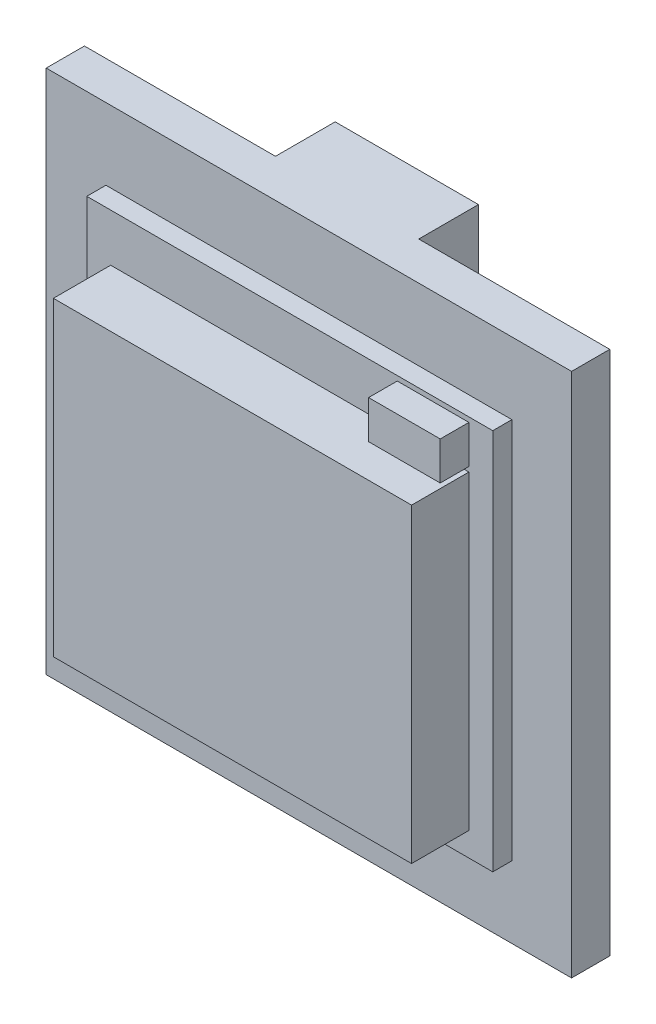
ISO-10303-21;
HEADER;
FILE_DESCRIPTION(('STEP AP214'),'2;1');
FILE_NAME('part.step','',(''),(''),'','','');
FILE_SCHEMA(('AUTOMOTIVE_DESIGN { 1 0 10303 214 1 1 1 1 }'));
ENDSEC;
DATA;
#1=APPLICATION_CONTEXT('core data for automotive mechanical design processes');
#2=APPLICATION_PROTOCOL_DEFINITION('international standard','automotive_design',2000,#1);
#3=PRODUCT_CONTEXT('',#1,'mechanical');
#4=PRODUCT('Part','Part','',(#3));
#5=PRODUCT_RELATED_PRODUCT_CATEGORY('part','',(#4));
#6=PRODUCT_DEFINITION_FORMATION('','',#4);
#7=PRODUCT_DEFINITION_CONTEXT('part definition',#1,'design');
#8=PRODUCT_DEFINITION('design','',#6,#7);
#9=PRODUCT_DEFINITION_SHAPE('','',#8);
#10=(LENGTH_UNIT() NAMED_UNIT(*) SI_UNIT(.MILLI.,.METRE.));
#11=(NAMED_UNIT(*) PLANE_ANGLE_UNIT() SI_UNIT($,.RADIAN.));
#12=(NAMED_UNIT(*) SI_UNIT($,.STERADIAN.) SOLID_ANGLE_UNIT());
#13=UNCERTAINTY_MEASURE_WITH_UNIT(LENGTH_MEASURE(1.E-05),#10,'distance_accuracy_value','');
#14=(GEOMETRIC_REPRESENTATION_CONTEXT(3) GLOBAL_UNCERTAINTY_ASSIGNED_CONTEXT((#13)) GLOBAL_UNIT_ASSIGNED_CONTEXT((#10,
#11,#12)) REPRESENTATION_CONTEXT('',''));
#15=CARTESIAN_POINT('',(0.,0.,0.));
#16=DIRECTION('',(0.,0.,1.));
#17=DIRECTION('',(1.,0.,0.));
#18=AXIS2_PLACEMENT_3D('',#15,#16,#17);
#19=CARTESIAN_POINT('',(0.,0.,15.5));
#20=DIRECTION('',(0.,0.,-1.));
#21=DIRECTION('',(-1.,0.,0.));
#22=AXIS2_PLACEMENT_3D('',#19,#20,#21);
#23=PLANE('',#22);
#24=DIRECTION('',(0.,1.,0.));
#25=VECTOR('',#24,1.);
#26=CARTESIAN_POINT('',(25.5,57.,15.5));
#27=LINE('',#26,#25);
#28=CARTESIAN_POINT('',(25.5,57.,15.5));
#29=VERTEX_POINT('',#28);
#30=CARTESIAN_POINT('',(25.5,70.,15.5));
#31=VERTEX_POINT('',#30);
#32=EDGE_CURVE('E197',#29,#31,#27,.T.);
#33=ORIENTED_EDGE('',*,*,#32,.F.);
#34=DIRECTION('',(1.,0.,0.));
#35=VECTOR('',#34,1.);
#36=CARTESIAN_POINT('',(10.5,57.,15.5));
#37=LINE('',#36,#35);
#38=CARTESIAN_POINT('',(10.5,57.,15.5));
#39=VERTEX_POINT('',#38);
#40=EDGE_CURVE('E210',#39,#29,#37,.T.);
#41=ORIENTED_EDGE('',*,*,#40,.F.);
#42=DIRECTION('',(0.,-1.,0.));
#43=VECTOR('',#42,1.);
#44=CARTESIAN_POINT('',(10.5,57.,15.5));
#45=LINE('',#44,#43);
#46=CARTESIAN_POINT('',(10.5,70.,15.5));
#47=VERTEX_POINT('',#46);
#48=EDGE_CURVE('E219',#47,#39,#45,.T.);
#49=ORIENTED_EDGE('',*,*,#48,.F.);
#50=DIRECTION('',(-1.,0.,0.));
#51=VECTOR('',#50,1.);
#52=CARTESIAN_POINT('',(10.5,70.,15.5));
#53=LINE('',#52,#51);
#54=EDGE_CURVE('E200',#31,#47,#53,.T.);
#55=ORIENTED_EDGE('',*,*,#54,.F.);
#56=EDGE_LOOP('',(#33,#41,#49,#55));
#57=FACE_BOUND('',#56,.T.);
#58=DIRECTION('',(0.,1.,0.));
#59=VECTOR('',#58,1.);
#60=CARTESIAN_POINT('',(26.5,56.,15.5));
#61=LINE('',#60,#59);
#62=CARTESIAN_POINT('',(26.5,56.,15.5));
#63=VERTEX_POINT('',#62);
#64=CARTESIAN_POINT('',(26.5,72.,15.5));
#65=VERTEX_POINT('',#64);
#66=EDGE_CURVE('E236',#63,#65,#61,.T.);
#67=ORIENTED_EDGE('',*,*,#66,.T.);
#68=DIRECTION('',(-1.,0.,0.));
#69=VECTOR('',#68,1.);
#70=CARTESIAN_POINT('',(9.5,72.,15.5));
#71=LINE('',#70,#69);
#72=CARTESIAN_POINT('',(9.5,72.,15.5));
#73=VERTEX_POINT('',#72);
#74=EDGE_CURVE('E239',#65,#73,#71,.T.);
#75=ORIENTED_EDGE('',*,*,#74,.T.);
#76=DIRECTION('',(0.,-1.,0.));
#77=VECTOR('',#76,1.);
#78=CARTESIAN_POINT('',(9.5,56.,15.5));
#79=LINE('',#78,#77);
#80=CARTESIAN_POINT('',(9.5,56.,15.5));
#81=VERTEX_POINT('',#80);
#82=EDGE_CURVE('E242',#73,#81,#79,.T.);
#83=ORIENTED_EDGE('',*,*,#82,.T.);
#84=DIRECTION('',(1.,0.,0.));
#85=VECTOR('',#84,1.);
#86=CARTESIAN_POINT('',(9.5,56.,15.5));
#87=LINE('',#86,#85);
#88=EDGE_CURVE('E244',#81,#63,#87,.T.);
#89=ORIENTED_EDGE('',*,*,#88,.T.);
#90=EDGE_LOOP('',(#67,#75,#83,#89));
#91=FACE_BOUND('',#90,.T.);
#92=DIRECTION('',(0.,1.,0.));
#93=VECTOR('',#92,1.);
#94=CARTESIAN_POINT('',(25.5,70.2,15.5));
#95=LINE('',#94,#93);
#96=CARTESIAN_POINT('',(25.5,70.2,15.5));
#97=VERTEX_POINT('',#96);
#98=CARTESIAN_POINT('',(25.5,71.8,15.5));
#99=VERTEX_POINT('',#98);
#100=EDGE_CURVE('E196',#97,#99,#95,.T.);
#101=ORIENTED_EDGE('',*,*,#100,.F.);
#102=DIRECTION('',(1.,0.,0.));
#103=VECTOR('',#102,1.);
#104=CARTESIAN_POINT('',(22.5,70.2,15.5));
#105=LINE('',#104,#103);
#106=CARTESIAN_POINT('',(22.5,70.2,15.5));
#107=VERTEX_POINT('',#106);
#108=EDGE_CURVE('E193',#107,#97,#105,.T.);
#109=ORIENTED_EDGE('',*,*,#108,.F.);
#110=DIRECTION('',(0.,-1.,0.));
#111=VECTOR('',#110,1.);
#112=CARTESIAN_POINT('',(22.5,70.2,15.5));
#113=LINE('',#112,#111);
#114=CARTESIAN_POINT('',(22.5,71.8,15.5));
#115=VERTEX_POINT('',#114);
#116=EDGE_CURVE('E59',#115,#107,#113,.T.);
#117=ORIENTED_EDGE('',*,*,#116,.F.);
#118=DIRECTION('',(-1.,0.,0.));
#119=VECTOR('',#118,1.);
#120=CARTESIAN_POINT('',(22.5,71.8,15.5));
#121=LINE('',#120,#119);
#122=EDGE_CURVE('E54',#99,#115,#121,.T.);
#123=ORIENTED_EDGE('',*,*,#122,.F.);
#124=EDGE_LOOP('',(#101,#109,#117,#123));
#125=FACE_BOUND('',#124,.T.);
#126=ADVANCED_FACE('F39',(#57,#91,#125),#23,.F.);
#127=CARTESIAN_POINT('',(0.,0.,14.7));
#128=DIRECTION('',(0.,0.,-1.));
#129=DIRECTION('',(-1.,0.,0.));
#130=AXIS2_PLACEMENT_3D('',#127,#128,#129);
#131=PLANE('',#130);
#132=DIRECTION('',(0.,1.,0.));
#133=VECTOR('',#132,1.);
#134=CARTESIAN_POINT('',(29.,53.,14.7));
#135=LINE('',#134,#133);
#136=CARTESIAN_POINT('',(29.,53.,14.7));
#137=VERTEX_POINT('',#136);
#138=CARTESIAN_POINT('',(29.,75.,14.7));
#139=VERTEX_POINT('',#138);
#140=EDGE_CURVE('E269',#137,#139,#135,.T.);
#141=ORIENTED_EDGE('',*,*,#140,.T.);
#142=DIRECTION('',(-1.,0.,0.));
#143=VECTOR('',#142,1.);
#144=CARTESIAN_POINT('',(7.,75.,14.7));
#145=LINE('',#144,#143);
#146=CARTESIAN_POINT('',(7.,75.,14.7));
#147=VERTEX_POINT('',#146);
#148=EDGE_CURVE('E272',#139,#147,#145,.T.);
#149=ORIENTED_EDGE('',*,*,#148,.T.);
#150=DIRECTION('',(0.,-1.,0.));
#151=VECTOR('',#150,1.);
#152=CARTESIAN_POINT('',(7.,53.,14.7));
#153=LINE('',#152,#151);
#154=CARTESIAN_POINT('',(7.,53.,14.7));
#155=VERTEX_POINT('',#154);
#156=EDGE_CURVE('E275',#147,#155,#153,.T.);
#157=ORIENTED_EDGE('',*,*,#156,.T.);
#158=DIRECTION('',(1.,0.,0.));
#159=VECTOR('',#158,1.);
#160=CARTESIAN_POINT('',(7.,53.,14.7));
#161=LINE('',#160,#159);
#162=EDGE_CURVE('E277',#155,#137,#161,.T.);
#163=ORIENTED_EDGE('',*,*,#162,.T.);
#164=EDGE_LOOP('',(#141,#149,#157,#163));
#165=FACE_BOUND('',#164,.T.);
#166=DIRECTION('',(0.,1.,0.));
#167=VECTOR('',#166,1.);
#168=CARTESIAN_POINT('',(26.5,56.,14.7));
#169=LINE('',#168,#167);
#170=CARTESIAN_POINT('',(26.5,56.,14.7));
#171=VERTEX_POINT('',#170);
#172=CARTESIAN_POINT('',(26.5,72.,14.7));
#173=VERTEX_POINT('',#172);
#174=EDGE_CURVE('E235',#171,#173,#169,.T.);
#175=ORIENTED_EDGE('',*,*,#174,.F.);
#176=DIRECTION('',(1.,0.,0.));
#177=VECTOR('',#176,1.);
#178=CARTESIAN_POINT('',(9.5,56.,14.7));
#179=LINE('',#178,#177);
#180=CARTESIAN_POINT('',(9.5,56.,14.7));
#181=VERTEX_POINT('',#180);
#182=EDGE_CURVE('E240',#181,#171,#179,.T.);
#183=ORIENTED_EDGE('',*,*,#182,.F.);
#184=DIRECTION('',(0.,-1.,0.));
#185=VECTOR('',#184,1.);
#186=CARTESIAN_POINT('',(9.5,56.,14.7));
#187=LINE('',#186,#185);
#188=CARTESIAN_POINT('',(9.5,72.,14.7));
#189=VERTEX_POINT('',#188);
#190=EDGE_CURVE('E252',#189,#181,#187,.T.);
#191=ORIENTED_EDGE('',*,*,#190,.F.);
#192=DIRECTION('',(-1.,0.,0.));
#193=VECTOR('',#192,1.);
#194=CARTESIAN_POINT('',(9.5,72.,14.7));
#195=LINE('',#194,#193);
#196=EDGE_CURVE('E249',#173,#189,#195,.T.);
#197=ORIENTED_EDGE('',*,*,#196,.F.);
#198=EDGE_LOOP('',(#175,#183,#191,#197));
#199=FACE_BOUND('',#198,.T.);
#200=ADVANCED_FACE('F348',(#165,#199),#131,.F.);
#201=CARTESIAN_POINT('',(21.,53.,13.1));
#202=DIRECTION('',(-1.,0.,0.));
#203=DIRECTION('',(0.,0.,1.));
#204=AXIS2_PLACEMENT_3D('',#201,#202,#203);
#205=PLANE('',#204);
#206=DIRECTION('',(0.,1.,0.));
#207=VECTOR('',#206,1.);
#208=CARTESIAN_POINT('',(21.,53.,10.6));
#209=LINE('',#208,#207);
#210=CARTESIAN_POINT('',(21.,53.,10.6));
#211=VERTEX_POINT('',#210);
#212=CARTESIAN_POINT('',(21.,75.,10.6));
#213=VERTEX_POINT('',#212);
#214=EDGE_CURVE('E302',#211,#213,#209,.T.);
#215=ORIENTED_EDGE('',*,*,#214,.T.);
#216=DIRECTION('',(0.,0.,-1.));
#217=VECTOR('',#216,1.);
#218=CARTESIAN_POINT('',(21.,75.,13.1));
#219=LINE('',#218,#217);
#220=CARTESIAN_POINT('',(21.,75.,13.1));
#221=VERTEX_POINT('',#220);
#222=EDGE_CURVE('E11',#221,#213,#219,.T.);
#223=ORIENTED_EDGE('',*,*,#222,.F.);
#224=DIRECTION('',(0.,1.,0.));
#225=VECTOR('',#224,1.);
#226=CARTESIAN_POINT('',(21.,53.,13.1));
#227=LINE('',#226,#225);
#228=CARTESIAN_POINT('',(21.,53.,13.1));
#229=VERTEX_POINT('',#228);
#230=EDGE_CURVE('E303',#229,#221,#227,.T.);
#231=ORIENTED_EDGE('',*,*,#230,.F.);
#232=DIRECTION('',(0.,0.,-1.));
#233=VECTOR('',#232,1.);
#234=CARTESIAN_POINT('',(21.,53.,13.1));
#235=LINE('',#234,#233);
#236=EDGE_CURVE('E310',#229,#211,#235,.T.);
#237=ORIENTED_EDGE('',*,*,#236,.T.);
#238=EDGE_LOOP('',(#215,#223,#231,#237));
#239=FACE_BOUND('',#238,.T.);
#240=ADVANCED_FACE('F41',(#239),#205,.F.);
#241=CARTESIAN_POINT('',(15.,75.,13.1));
#242=DIRECTION('',(0.,-1.,0.));
#243=DIRECTION('',(0.,0.,-1.));
#244=AXIS2_PLACEMENT_3D('',#241,#242,#243);
#245=PLANE('',#244);
#246=DIRECTION('',(-1.,0.,0.));
#247=VECTOR('',#246,1.);
#248=CARTESIAN_POINT('',(15.,75.,10.6));
#249=LINE('',#248,#247);
#250=CARTESIAN_POINT('',(15.,75.,10.6));
#251=VERTEX_POINT('',#250);
#252=EDGE_CURVE('E313',#213,#251,#249,.T.);
#253=ORIENTED_EDGE('',*,*,#252,.T.);
#254=DIRECTION('',(0.,0.,-1.));
#255=VECTOR('',#254,1.);
#256=CARTESIAN_POINT('',(15.,75.,13.1));
#257=LINE('',#256,#255);
#258=CARTESIAN_POINT('',(15.,75.,13.1));
#259=VERTEX_POINT('',#258);
#260=EDGE_CURVE('E47',#259,#251,#257,.T.);
#261=ORIENTED_EDGE('',*,*,#260,.F.);
#262=DIRECTION('',(-1.,0.,0.));
#263=VECTOR('',#262,1.);
#264=CARTESIAN_POINT('',(7.,75.,13.1));
#265=LINE('',#264,#263);
#266=CARTESIAN_POINT('',(7.,75.,13.1));
#267=VERTEX_POINT('',#266);
#268=EDGE_CURVE('E282',#259,#267,#265,.T.);
#269=ORIENTED_EDGE('',*,*,#268,.T.);
#270=DIRECTION('',(0.,0.,-1.));
#271=VECTOR('',#270,1.);
#272=CARTESIAN_POINT('',(7.,75.,14.7));
#273=LINE('',#272,#271);
#274=EDGE_CURVE('E296',#147,#267,#273,.T.);
#275=ORIENTED_EDGE('',*,*,#274,.F.);
#276=ORIENTED_EDGE('',*,*,#148,.F.);
#277=DIRECTION('',(0.,0.,-1.));
#278=VECTOR('',#277,1.);
#279=CARTESIAN_POINT('',(29.,75.,14.7));
#280=LINE('',#279,#278);
#281=CARTESIAN_POINT('',(29.,75.,13.1));
#282=VERTEX_POINT('',#281);
#283=EDGE_CURVE('E299',#139,#282,#280,.T.);
#284=ORIENTED_EDGE('',*,*,#283,.T.);
#285=EDGE_CURVE('E283',#282,#221,#265,.T.);
#286=ORIENTED_EDGE('',*,*,#285,.T.);
#287=ORIENTED_EDGE('',*,*,#222,.T.);
#288=EDGE_LOOP('',(#253,#261,#269,#275,#276,#284,#286,#287));
#289=FACE_BOUND('',#288,.T.);
#290=ADVANCED_FACE('F358',(#289),#245,.F.);
#291=CARTESIAN_POINT('',(15.,53.,13.1));
#292=DIRECTION('',(1.,0.,0.));
#293=DIRECTION('',(0.,0.,-1.));
#294=AXIS2_PLACEMENT_3D('',#291,#292,#293);
#295=PLANE('',#294);
#296=DIRECTION('',(0.,-1.,0.));
#297=VECTOR('',#296,1.);
#298=CARTESIAN_POINT('',(15.,53.,10.6));
#299=LINE('',#298,#297);
#300=CARTESIAN_POINT('',(15.,53.,10.6));
#301=VERTEX_POINT('',#300);
#302=EDGE_CURVE('E315',#251,#301,#299,.T.);
#303=ORIENTED_EDGE('',*,*,#302,.T.);
#304=DIRECTION('',(0.,0.,-1.));
#305=VECTOR('',#304,1.);
#306=CARTESIAN_POINT('',(15.,53.,13.1));
#307=LINE('',#306,#305);
#308=CARTESIAN_POINT('',(15.,53.,13.1));
#309=VERTEX_POINT('',#308);
#310=EDGE_CURVE('E320',#309,#301,#307,.T.);
#311=ORIENTED_EDGE('',*,*,#310,.F.);
#312=DIRECTION('',(0.,-1.,0.));
#313=VECTOR('',#312,1.);
#314=CARTESIAN_POINT('',(15.,53.,13.1));
#315=LINE('',#314,#313);
#316=EDGE_CURVE('E306',#259,#309,#315,.T.);
#317=ORIENTED_EDGE('',*,*,#316,.F.);
#318=ORIENTED_EDGE('',*,*,#260,.T.);
#319=EDGE_LOOP('',(#303,#311,#317,#318));
#320=FACE_BOUND('',#319,.T.);
#321=ADVANCED_FACE('F326',(#320),#295,.F.);
#322=CARTESIAN_POINT('',(15.,53.,13.1));
#323=DIRECTION('',(0.,1.,0.));
#324=DIRECTION('',(0.,0.,1.));
#325=AXIS2_PLACEMENT_3D('',#322,#323,#324);
#326=PLANE('',#325);
#327=DIRECTION('',(1.,0.,0.));
#328=VECTOR('',#327,1.);
#329=CARTESIAN_POINT('',(15.,53.,10.6));
#330=LINE('',#329,#328);
#331=EDGE_CURVE('E307',#301,#211,#330,.T.);
#332=ORIENTED_EDGE('',*,*,#331,.T.);
#333=ORIENTED_EDGE('',*,*,#236,.F.);
#334=DIRECTION('',(1.,0.,0.));
#335=VECTOR('',#334,1.);
#336=CARTESIAN_POINT('',(7.,53.,13.1));
#337=LINE('',#336,#335);
#338=CARTESIAN_POINT('',(29.,53.,13.1));
#339=VERTEX_POINT('',#338);
#340=EDGE_CURVE('E288',#229,#339,#337,.T.);
#341=ORIENTED_EDGE('',*,*,#340,.T.);
#342=DIRECTION('',(0.,0.,-1.));
#343=VECTOR('',#342,1.);
#344=CARTESIAN_POINT('',(29.,53.,14.7));
#345=LINE('',#344,#343);
#346=EDGE_CURVE('E279',#137,#339,#345,.T.);
#347=ORIENTED_EDGE('',*,*,#346,.F.);
#348=ORIENTED_EDGE('',*,*,#162,.F.);
#349=DIRECTION('',(0.,0.,-1.));
#350=VECTOR('',#349,1.);
#351=CARTESIAN_POINT('',(7.,53.,14.7));
#352=LINE('',#351,#350);
#353=CARTESIAN_POINT('',(7.,53.,13.1));
#354=VERTEX_POINT('',#353);
#355=EDGE_CURVE('E293',#155,#354,#352,.T.);
#356=ORIENTED_EDGE('',*,*,#355,.T.);
#357=EDGE_CURVE('E273',#354,#309,#337,.T.);
#358=ORIENTED_EDGE('',*,*,#357,.T.);
#359=ORIENTED_EDGE('',*,*,#310,.T.);
#360=EDGE_LOOP('',(#332,#333,#341,#347,#348,#356,#358,#359));
#361=FACE_BOUND('',#360,.T.);
#362=ADVANCED_FACE('F334',(#361),#326,.F.);
#363=CARTESIAN_POINT('',(0.,0.,10.6));
#364=DIRECTION('',(0.,0.,-1.));
#365=DIRECTION('',(-1.,0.,0.));
#366=AXIS2_PLACEMENT_3D('',#363,#364,#365);
#367=PLANE('',#366);
#368=ORIENTED_EDGE('',*,*,#214,.F.);
#369=ORIENTED_EDGE('',*,*,#331,.F.);
#370=ORIENTED_EDGE('',*,*,#302,.F.);
#371=ORIENTED_EDGE('',*,*,#252,.F.);
#372=EDGE_LOOP('',(#368,#369,#370,#371));
#373=FACE_BOUND('',#372,.T.);
#374=ADVANCED_FACE('F332',(#373),#367,.T.);
#375=CARTESIAN_POINT('',(0.,0.,13.1));
#376=DIRECTION('',(0.,0.,-1.));
#377=DIRECTION('',(-1.,0.,0.));
#378=AXIS2_PLACEMENT_3D('',#375,#376,#377);
#379=PLANE('',#378);
#380=ORIENTED_EDGE('',*,*,#340,.F.);
#381=ORIENTED_EDGE('',*,*,#230,.T.);
#382=ORIENTED_EDGE('',*,*,#285,.F.);
#383=DIRECTION('',(0.,1.,0.));
#384=VECTOR('',#383,1.);
#385=CARTESIAN_POINT('',(29.,53.,13.1));
#386=LINE('',#385,#384);
#387=EDGE_CURVE('E268',#339,#282,#386,.T.);
#388=ORIENTED_EDGE('',*,*,#387,.F.);
#389=EDGE_LOOP('',(#380,#381,#382,#388));
#390=FACE_BOUND('',#389,.T.);
#391=ADVANCED_FACE('F340',(#390),#379,.T.);
#392=CARTESIAN_POINT('',(29.,53.,14.7));
#393=DIRECTION('',(-1.,0.,0.));
#394=DIRECTION('',(0.,0.,1.));
#395=AXIS2_PLACEMENT_3D('',#392,#393,#394);
#396=PLANE('',#395);
#397=ORIENTED_EDGE('',*,*,#387,.T.);
#398=ORIENTED_EDGE('',*,*,#283,.F.);
#399=ORIENTED_EDGE('',*,*,#140,.F.);
#400=ORIENTED_EDGE('',*,*,#346,.T.);
#401=EDGE_LOOP('',(#397,#398,#399,#400));
#402=FACE_BOUND('',#401,.T.);
#403=ADVANCED_FACE('F345',(#402),#396,.F.);
#404=CARTESIAN_POINT('',(7.,53.,14.7));
#405=DIRECTION('',(1.,0.,0.));
#406=DIRECTION('',(0.,0.,-1.));
#407=AXIS2_PLACEMENT_3D('',#404,#405,#406);
#408=PLANE('',#407);
#409=DIRECTION('',(0.,-1.,0.));
#410=VECTOR('',#409,1.);
#411=CARTESIAN_POINT('',(7.,53.,13.1));
#412=LINE('',#411,#410);
#413=EDGE_CURVE('E286',#267,#354,#412,.T.);
#414=ORIENTED_EDGE('',*,*,#413,.T.);
#415=ORIENTED_EDGE('',*,*,#355,.F.);
#416=ORIENTED_EDGE('',*,*,#156,.F.);
#417=ORIENTED_EDGE('',*,*,#274,.T.);
#418=EDGE_LOOP('',(#414,#415,#416,#417));
#419=FACE_BOUND('',#418,.T.);
#420=ADVANCED_FACE('F359',(#419),#408,.F.);
#421=ORIENTED_EDGE('',*,*,#268,.F.);
#422=ORIENTED_EDGE('',*,*,#316,.T.);
#423=ORIENTED_EDGE('',*,*,#357,.F.);
#424=ORIENTED_EDGE('',*,*,#413,.F.);
#425=EDGE_LOOP('',(#421,#422,#423,#424));
#426=FACE_BOUND('',#425,.T.);
#427=ADVANCED_FACE('F357',(#426),#379,.T.);
#428=CARTESIAN_POINT('',(26.5,56.,15.5));
#429=DIRECTION('',(-1.,0.,0.));
#430=DIRECTION('',(0.,0.,1.));
#431=AXIS2_PLACEMENT_3D('',#428,#429,#430);
#432=PLANE('',#431);
#433=ORIENTED_EDGE('',*,*,#174,.T.);
#434=DIRECTION('',(0.,0.,-1.));
#435=VECTOR('',#434,1.);
#436=CARTESIAN_POINT('',(26.5,72.,15.5));
#437=LINE('',#436,#435);
#438=EDGE_CURVE('E265',#65,#173,#437,.T.);
#439=ORIENTED_EDGE('',*,*,#438,.F.);
#440=ORIENTED_EDGE('',*,*,#66,.F.);
#441=DIRECTION('',(0.,0.,-1.));
#442=VECTOR('',#441,1.);
#443=CARTESIAN_POINT('',(26.5,56.,15.5));
#444=LINE('',#443,#442);
#445=EDGE_CURVE('E246',#63,#171,#444,.T.);
#446=ORIENTED_EDGE('',*,*,#445,.T.);
#447=EDGE_LOOP('',(#433,#439,#440,#446));
#448=FACE_BOUND('',#447,.T.);
#449=ADVANCED_FACE('F366',(#448),#432,.F.);
#450=CARTESIAN_POINT('',(9.5,72.,15.5));
#451=DIRECTION('',(0.,-1.,0.));
#452=DIRECTION('',(0.,0.,-1.));
#453=AXIS2_PLACEMENT_3D('',#450,#451,#452);
#454=PLANE('',#453);
#455=ORIENTED_EDGE('',*,*,#196,.T.);
#456=DIRECTION('',(0.,0.,-1.));
#457=VECTOR('',#456,1.);
#458=CARTESIAN_POINT('',(9.5,72.,15.5));
#459=LINE('',#458,#457);
#460=EDGE_CURVE('E262',#73,#189,#459,.T.);
#461=ORIENTED_EDGE('',*,*,#460,.F.);
#462=ORIENTED_EDGE('',*,*,#74,.F.);
#463=ORIENTED_EDGE('',*,*,#438,.T.);
#464=EDGE_LOOP('',(#455,#461,#462,#463));
#465=FACE_BOUND('',#464,.T.);
#466=ADVANCED_FACE('F388',(#465),#454,.F.);
#467=CARTESIAN_POINT('',(9.5,56.,15.5));
#468=DIRECTION('',(1.,0.,0.));
#469=DIRECTION('',(0.,0.,-1.));
#470=AXIS2_PLACEMENT_3D('',#467,#468,#469);
#471=PLANE('',#470);
#472=ORIENTED_EDGE('',*,*,#190,.T.);
#473=DIRECTION('',(0.,0.,-1.));
#474=VECTOR('',#473,1.);
#475=CARTESIAN_POINT('',(9.5,56.,15.5));
#476=LINE('',#475,#474);
#477=EDGE_CURVE('E259',#81,#181,#476,.T.);
#478=ORIENTED_EDGE('',*,*,#477,.F.);
#479=ORIENTED_EDGE('',*,*,#82,.F.);
#480=ORIENTED_EDGE('',*,*,#460,.T.);
#481=EDGE_LOOP('',(#472,#478,#479,#480));
#482=FACE_BOUND('',#481,.T.);
#483=ADVANCED_FACE('F384',(#482),#471,.F.);
#484=CARTESIAN_POINT('',(9.5,56.,15.5));
#485=DIRECTION('',(0.,1.,0.));
#486=DIRECTION('',(0.,0.,1.));
#487=AXIS2_PLACEMENT_3D('',#484,#485,#486);
#488=PLANE('',#487);
#489=ORIENTED_EDGE('',*,*,#182,.T.);
#490=ORIENTED_EDGE('',*,*,#445,.F.);
#491=ORIENTED_EDGE('',*,*,#88,.F.);
#492=ORIENTED_EDGE('',*,*,#477,.T.);
#493=EDGE_LOOP('',(#489,#490,#491,#492));
#494=FACE_BOUND('',#493,.T.);
#495=ADVANCED_FACE('F381',(#494),#488,.F.);
#496=CARTESIAN_POINT('',(25.5,57.,17.9));
#497=DIRECTION('',(-1.,0.,0.));
#498=DIRECTION('',(0.,0.,1.));
#499=AXIS2_PLACEMENT_3D('',#496,#497,#498);
#500=PLANE('',#499);
#501=ORIENTED_EDGE('',*,*,#32,.T.);
#502=DIRECTION('',(0.,0.,-1.));
#503=VECTOR('',#502,1.);
#504=CARTESIAN_POINT('',(25.5,70.,17.9));
#505=LINE('',#504,#503);
#506=CARTESIAN_POINT('',(25.5,70.,17.9));
#507=VERTEX_POINT('',#506);
#508=EDGE_CURVE('E232',#507,#31,#505,.T.);
#509=ORIENTED_EDGE('',*,*,#508,.F.);
#510=DIRECTION('',(0.,1.,0.));
#511=VECTOR('',#510,1.);
#512=CARTESIAN_POINT('',(25.5,57.,17.9));
#513=LINE('',#512,#511);
#514=CARTESIAN_POINT('',(25.5,57.,17.9));
#515=VERTEX_POINT('',#514);
#516=EDGE_CURVE('E206',#515,#507,#513,.T.);
#517=ORIENTED_EDGE('',*,*,#516,.F.);
#518=DIRECTION('',(0.,0.,-1.));
#519=VECTOR('',#518,1.);
#520=CARTESIAN_POINT('',(25.5,57.,17.9));
#521=LINE('',#520,#519);
#522=EDGE_CURVE('E215',#515,#29,#521,.T.);
#523=ORIENTED_EDGE('',*,*,#522,.T.);
#524=EDGE_LOOP('',(#501,#509,#517,#523));
#525=FACE_BOUND('',#524,.T.);
#526=ADVANCED_FACE('F379',(#525),#500,.F.);
#527=CARTESIAN_POINT('',(10.5,70.,17.9));
#528=DIRECTION('',(0.,-1.,0.));
#529=DIRECTION('',(0.,0.,-1.));
#530=AXIS2_PLACEMENT_3D('',#527,#528,#529);
#531=PLANE('',#530);
#532=ORIENTED_EDGE('',*,*,#54,.T.);
#533=DIRECTION('',(0.,0.,-1.));
#534=VECTOR('',#533,1.);
#535=CARTESIAN_POINT('',(10.5,70.,17.9));
#536=LINE('',#535,#534);
#537=CARTESIAN_POINT('',(10.5,70.,17.9));
#538=VERTEX_POINT('',#537);
#539=EDGE_CURVE('E229',#538,#47,#536,.T.);
#540=ORIENTED_EDGE('',*,*,#539,.F.);
#541=DIRECTION('',(-1.,0.,0.));
#542=VECTOR('',#541,1.);
#543=CARTESIAN_POINT('',(10.5,70.,17.9));
#544=LINE('',#543,#542);
#545=EDGE_CURVE('E209',#507,#538,#544,.T.);
#546=ORIENTED_EDGE('',*,*,#545,.F.);
#547=ORIENTED_EDGE('',*,*,#508,.T.);
#548=EDGE_LOOP('',(#532,#540,#546,#547));
#549=FACE_BOUND('',#548,.T.);
#550=ADVANCED_FACE('F441',(#549),#531,.F.);
#551=CARTESIAN_POINT('',(10.5,57.,17.9));
#552=DIRECTION('',(1.,0.,0.));
#553=DIRECTION('',(0.,0.,-1.));
#554=AXIS2_PLACEMENT_3D('',#551,#552,#553);
#555=PLANE('',#554);
#556=ORIENTED_EDGE('',*,*,#48,.T.);
#557=DIRECTION('',(0.,0.,-1.));
#558=VECTOR('',#557,1.);
#559=CARTESIAN_POINT('',(10.5,57.,17.9));
#560=LINE('',#559,#558);
#561=CARTESIAN_POINT('',(10.5,57.,17.9));
#562=VERTEX_POINT('',#561);
#563=EDGE_CURVE('E226',#562,#39,#560,.T.);
#564=ORIENTED_EDGE('',*,*,#563,.F.);
#565=DIRECTION('',(0.,-1.,0.));
#566=VECTOR('',#565,1.);
#567=CARTESIAN_POINT('',(10.5,57.,17.9));
#568=LINE('',#567,#566);
#569=EDGE_CURVE('E212',#538,#562,#568,.T.);
#570=ORIENTED_EDGE('',*,*,#569,.F.);
#571=ORIENTED_EDGE('',*,*,#539,.T.);
#572=EDGE_LOOP('',(#556,#564,#570,#571));
#573=FACE_BOUND('',#572,.T.);
#574=ADVANCED_FACE('F438',(#573),#555,.F.);
#575=CARTESIAN_POINT('',(10.5,57.,17.9));
#576=DIRECTION('',(0.,1.,0.));
#577=DIRECTION('',(0.,0.,1.));
#578=AXIS2_PLACEMENT_3D('',#575,#576,#577);
#579=PLANE('',#578);
#580=ORIENTED_EDGE('',*,*,#40,.T.);
#581=ORIENTED_EDGE('',*,*,#522,.F.);
#582=DIRECTION('',(1.,0.,0.));
#583=VECTOR('',#582,1.);
#584=CARTESIAN_POINT('',(10.5,57.,17.9));
#585=LINE('',#584,#583);
#586=EDGE_CURVE('E214',#562,#515,#585,.T.);
#587=ORIENTED_EDGE('',*,*,#586,.F.);
#588=ORIENTED_EDGE('',*,*,#563,.T.);
#589=EDGE_LOOP('',(#580,#581,#587,#588));
#590=FACE_BOUND('',#589,.T.);
#591=ADVANCED_FACE('F434',(#590),#579,.F.);
#592=CARTESIAN_POINT('',(0.,0.,17.9));
#593=DIRECTION('',(0.,0.,-1.));
#594=DIRECTION('',(-1.,0.,0.));
#595=AXIS2_PLACEMENT_3D('',#592,#593,#594);
#596=PLANE('',#595);
#597=ORIENTED_EDGE('',*,*,#516,.T.);
#598=ORIENTED_EDGE('',*,*,#545,.T.);
#599=ORIENTED_EDGE('',*,*,#569,.T.);
#600=ORIENTED_EDGE('',*,*,#586,.T.);
#601=EDGE_LOOP('',(#597,#598,#599,#600));
#602=FACE_BOUND('',#601,.T.);
#603=ADVANCED_FACE('F431',(#602),#596,.F.);
#604=CARTESIAN_POINT('',(25.5,70.2,16.7));
#605=DIRECTION('',(-1.,0.,0.));
#606=DIRECTION('',(0.,0.,1.));
#607=AXIS2_PLACEMENT_3D('',#604,#605,#606);
#608=PLANE('',#607);
#609=ORIENTED_EDGE('',*,*,#100,.T.);
#610=DIRECTION('',(0.,0.,-1.));
#611=VECTOR('',#610,1.);
#612=CARTESIAN_POINT('',(25.5,71.8,16.7));
#613=LINE('',#612,#611);
#614=CARTESIAN_POINT('',(25.5,71.8,16.7));
#615=VERTEX_POINT('',#614);
#616=EDGE_CURVE('E177',#615,#99,#613,.T.);
#617=ORIENTED_EDGE('',*,*,#616,.F.);
#618=DIRECTION('',(0.,1.,0.));
#619=VECTOR('',#618,1.);
#620=CARTESIAN_POINT('',(25.5,70.2,16.7));
#621=LINE('',#620,#619);
#622=CARTESIAN_POINT('',(25.5,70.2,16.7));
#623=VERTEX_POINT('',#622);
#624=EDGE_CURVE('E184',#623,#615,#621,.T.);
#625=ORIENTED_EDGE('',*,*,#624,.F.);
#626=DIRECTION('',(0.,0.,-1.));
#627=VECTOR('',#626,1.);
#628=CARTESIAN_POINT('',(25.5,70.2,16.7));
#629=LINE('',#628,#627);
#630=EDGE_CURVE('E409',#623,#97,#629,.T.);
#631=ORIENTED_EDGE('',*,*,#630,.T.);
#632=EDGE_LOOP('',(#609,#617,#625,#631));
#633=FACE_BOUND('',#632,.T.);
#634=ADVANCED_FACE('F195',(#633),#608,.F.);
#635=CARTESIAN_POINT('',(22.5,71.8,16.7));
#636=DIRECTION('',(0.,-1.,0.));
#637=DIRECTION('',(0.,0.,-1.));
#638=AXIS2_PLACEMENT_3D('',#635,#636,#637);
#639=PLANE('',#638);
#640=ORIENTED_EDGE('',*,*,#122,.T.);
#641=DIRECTION('',(0.,0.,-1.));
#642=VECTOR('',#641,1.);
#643=CARTESIAN_POINT('',(22.5,71.8,16.7));
#644=LINE('',#643,#642);
#645=CARTESIAN_POINT('',(22.5,71.8,16.7));
#646=VERTEX_POINT('',#645);
#647=EDGE_CURVE('E180',#646,#115,#644,.T.);
#648=ORIENTED_EDGE('',*,*,#647,.F.);
#649=DIRECTION('',(-1.,0.,0.));
#650=VECTOR('',#649,1.);
#651=CARTESIAN_POINT('',(22.5,71.8,16.7));
#652=LINE('',#651,#650);
#653=EDGE_CURVE('E173',#615,#646,#652,.T.);
#654=ORIENTED_EDGE('',*,*,#653,.F.);
#655=ORIENTED_EDGE('',*,*,#616,.T.);
#656=EDGE_LOOP('',(#640,#648,#654,#655));
#657=FACE_BOUND('',#656,.T.);
#658=ADVANCED_FACE('F175',(#657),#639,.F.);
#659=CARTESIAN_POINT('',(22.5,70.2,16.7));
#660=DIRECTION('',(1.,0.,0.));
#661=DIRECTION('',(0.,0.,-1.));
#662=AXIS2_PLACEMENT_3D('',#659,#660,#661);
#663=PLANE('',#662);
#664=ORIENTED_EDGE('',*,*,#116,.T.);
#665=DIRECTION('',(0.,0.,-1.));
#666=VECTOR('',#665,1.);
#667=CARTESIAN_POINT('',(22.5,70.2,16.7));
#668=LINE('',#667,#666);
#669=CARTESIAN_POINT('',(22.5,70.2,16.7));
#670=VERTEX_POINT('',#669);
#671=EDGE_CURVE('E202',#670,#107,#668,.T.);
#672=ORIENTED_EDGE('',*,*,#671,.F.);
#673=DIRECTION('',(0.,-1.,0.));
#674=VECTOR('',#673,1.);
#675=CARTESIAN_POINT('',(22.5,70.2,16.7));
#676=LINE('',#675,#674);
#677=EDGE_CURVE('E183',#646,#670,#676,.T.);
#678=ORIENTED_EDGE('',*,*,#677,.F.);
#679=ORIENTED_EDGE('',*,*,#647,.T.);
#680=EDGE_LOOP('',(#664,#672,#678,#679));
#681=FACE_BOUND('',#680,.T.);
#682=ADVANCED_FACE('F418',(#681),#663,.F.);
#683=CARTESIAN_POINT('',(22.5,70.2,16.7));
#684=DIRECTION('',(0.,1.,0.));
#685=DIRECTION('',(0.,0.,1.));
#686=AXIS2_PLACEMENT_3D('',#683,#684,#685);
#687=PLANE('',#686);
#688=ORIENTED_EDGE('',*,*,#108,.T.);
#689=ORIENTED_EDGE('',*,*,#630,.F.);
#690=DIRECTION('',(1.,0.,0.));
#691=VECTOR('',#690,1.);
#692=CARTESIAN_POINT('',(22.5,70.2,16.7));
#693=LINE('',#692,#691);
#694=EDGE_CURVE('E189',#670,#623,#693,.T.);
#695=ORIENTED_EDGE('',*,*,#694,.F.);
#696=ORIENTED_EDGE('',*,*,#671,.T.);
#697=EDGE_LOOP('',(#688,#689,#695,#696));
#698=FACE_BOUND('',#697,.T.);
#699=ADVANCED_FACE('F408',(#698),#687,.F.);
#700=CARTESIAN_POINT('',(0.,0.,16.7));
#701=DIRECTION('',(0.,0.,-1.));
#702=DIRECTION('',(-1.,0.,0.));
#703=AXIS2_PLACEMENT_3D('',#700,#701,#702);
#704=PLANE('',#703);
#705=ORIENTED_EDGE('',*,*,#624,.T.);
#706=ORIENTED_EDGE('',*,*,#653,.T.);
#707=ORIENTED_EDGE('',*,*,#677,.T.);
#708=ORIENTED_EDGE('',*,*,#694,.T.);
#709=EDGE_LOOP('',(#705,#706,#707,#708));
#710=FACE_BOUND('',#709,.T.);
#711=ADVANCED_FACE('F187',(#710),#704,.F.);
#712=CLOSED_SHELL('',(#126,#200,#240,#290,#321,#362,#374,#391,#403,#420,#427,#449,#466,#483,
#495,#526,#550,#574,#591,#603,#634,#658,#682,#699,#711));
#713=MANIFOLD_SOLID_BREP('B2',#712);
#714=ADVANCED_BREP_SHAPE_REPRESENTATION('',(#18,#713),#14);
#715=SHAPE_DEFINITION_REPRESENTATION(#9,#714);
ENDSEC;
END-ISO-10303-21;
